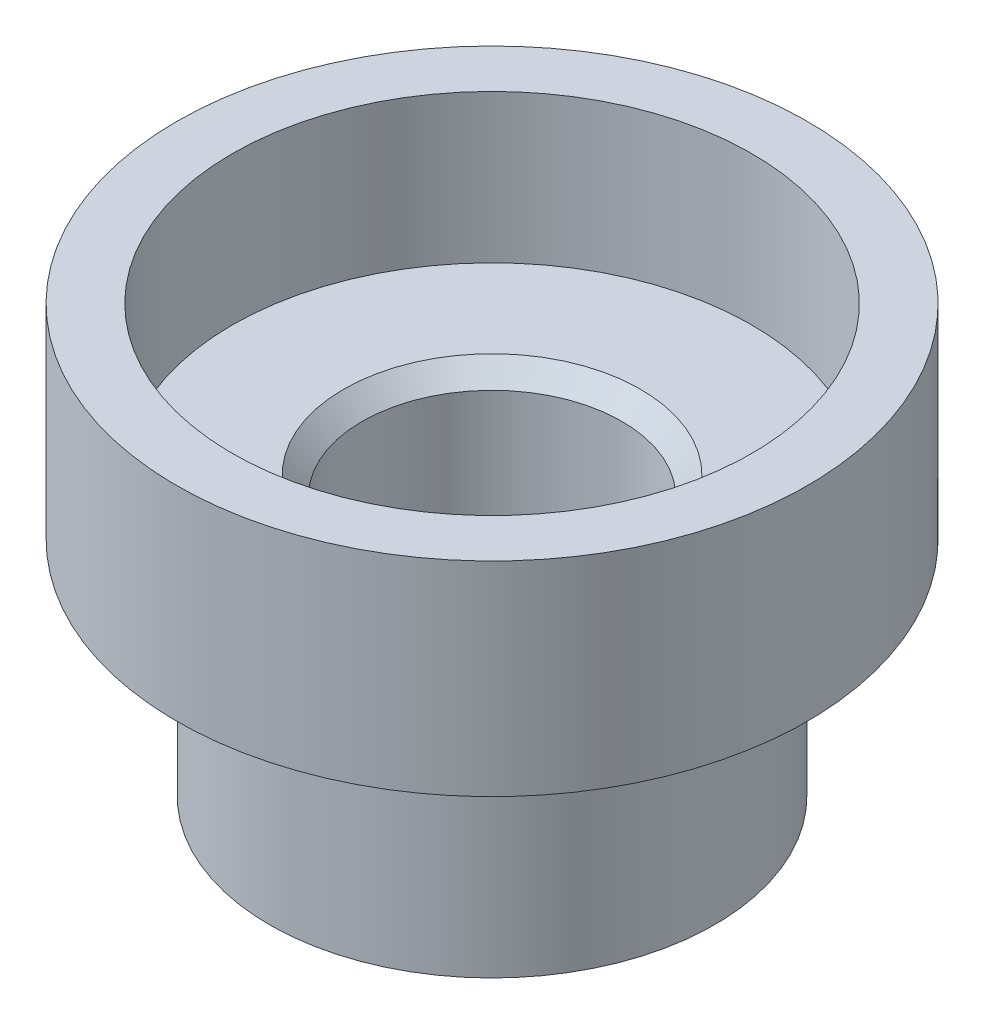
ISO-10303-21;
HEADER;
FILE_DESCRIPTION(('STEP AP214'),'2;1');
FILE_NAME('part.step','',(''),(''),'','','');
FILE_SCHEMA(('AUTOMOTIVE_DESIGN { 1 0 10303 214 1 1 1 1 }'));
ENDSEC;
DATA;
#1=APPLICATION_CONTEXT('core data for automotive mechanical design processes');
#2=APPLICATION_PROTOCOL_DEFINITION('international standard','automotive_design',2000,#1);
#3=PRODUCT_CONTEXT('',#1,'mechanical');
#4=PRODUCT('Part','Part','',(#3));
#5=PRODUCT_RELATED_PRODUCT_CATEGORY('part','',(#4));
#6=PRODUCT_DEFINITION_FORMATION('','',#4);
#7=PRODUCT_DEFINITION_CONTEXT('part definition',#1,'design');
#8=PRODUCT_DEFINITION('design','',#6,#7);
#9=PRODUCT_DEFINITION_SHAPE('','',#8);
#10=(LENGTH_UNIT() NAMED_UNIT(*) SI_UNIT(.MILLI.,.METRE.));
#11=(NAMED_UNIT(*) PLANE_ANGLE_UNIT() SI_UNIT($,.RADIAN.));
#12=(NAMED_UNIT(*) SI_UNIT($,.STERADIAN.) SOLID_ANGLE_UNIT());
#13=UNCERTAINTY_MEASURE_WITH_UNIT(LENGTH_MEASURE(1.E-05),#10,'distance_accuracy_value','');
#14=(GEOMETRIC_REPRESENTATION_CONTEXT(3) GLOBAL_UNCERTAINTY_ASSIGNED_CONTEXT((#13)) GLOBAL_UNIT_ASSIGNED_CONTEXT((#10,
#11,#12)) REPRESENTATION_CONTEXT('',''));
#15=CARTESIAN_POINT('',(0.,0.,0.));
#16=DIRECTION('',(0.,0.,1.));
#17=DIRECTION('',(1.,0.,0.));
#18=AXIS2_PLACEMENT_3D('',#15,#16,#17);
#19=CARTESIAN_POINT('',(0.,0.,0.));
#20=DIRECTION('',(0.,1.,0.));
#21=DIRECTION('',(1.,0.,0.));
#22=AXIS2_PLACEMENT_3D('',#19,#20,#21);
#23=PLANE('',#22);
#24=CARTESIAN_POINT('',(0.,0.,0.));
#25=DIRECTION('',(0.,1.,0.));
#26=DIRECTION('',(-1.,0.,0.));
#27=AXIS2_PLACEMENT_3D('',#24,#25,#26);
#28=CIRCLE('',#27,3.4);
#29=CARTESIAN_POINT('',(-3.4,0.,0.));
#30=VERTEX_POINT('',#29);
#31=EDGE_CURVE('E22',#30,#30,#28,.T.);
#32=ORIENTED_EDGE('',*,*,#31,.T.);
#33=EDGE_LOOP('',(#32));
#34=FACE_BOUND('',#33,.T.);
#35=CARTESIAN_POINT('',(0.,0.,0.));
#36=DIRECTION('',(0.,1.,0.));
#37=DIRECTION('',(-1.,0.,0.));
#38=AXIS2_PLACEMENT_3D('',#35,#36,#37);
#39=CIRCLE('',#38,2.8);
#40=CARTESIAN_POINT('',(-2.8,0.,0.));
#41=VERTEX_POINT('',#40);
#42=EDGE_CURVE('E48',#41,#41,#39,.T.);
#43=ORIENTED_EDGE('',*,*,#42,.F.);
#44=EDGE_LOOP('',(#43));
#45=FACE_BOUND('',#44,.T.);
#46=ADVANCED_FACE('F15',(#34,#45),#23,.T.);
#47=CARTESIAN_POINT('',(0.,-2.2,0.));
#48=DIRECTION('',(0.,-1.,0.));
#49=DIRECTION('',(0.,0.,-1.));
#50=AXIS2_PLACEMENT_3D('',#47,#48,#49);
#51=PLANE('',#50);
#52=CARTESIAN_POINT('',(0.,-2.2,0.));
#53=DIRECTION('',(0.,1.,0.));
#54=DIRECTION('',(-1.,0.,0.));
#55=AXIS2_PLACEMENT_3D('',#52,#53,#54);
#56=CIRCLE('',#55,3.4);
#57=CARTESIAN_POINT('',(-3.4,-2.2,0.));
#58=VERTEX_POINT('',#57);
#59=EDGE_CURVE('E10',#58,#58,#56,.T.);
#60=ORIENTED_EDGE('',*,*,#59,.F.);
#61=EDGE_LOOP('',(#60));
#62=FACE_BOUND('',#61,.T.);
#63=CARTESIAN_POINT('',(0.,-2.2,0.));
#64=DIRECTION('',(0.,1.,0.));
#65=DIRECTION('',(-1.,0.,0.));
#66=AXIS2_PLACEMENT_3D('',#63,#64,#65);
#67=CIRCLE('',#66,2.6);
#68=CARTESIAN_POINT('',(-2.6,-2.2,0.));
#69=VERTEX_POINT('',#68);
#70=EDGE_CURVE('E39',#69,#69,#67,.T.);
#71=ORIENTED_EDGE('',*,*,#70,.T.);
#72=EDGE_LOOP('',(#71));
#73=FACE_BOUND('',#72,.T.);
#74=ADVANCED_FACE('F67',(#62,#73),#51,.T.);
#75=CARTESIAN_POINT('',(0.,0.,0.));
#76=DIRECTION('',(0.,1.,0.));
#77=DIRECTION('',(1.,0.,0.));
#78=AXIS2_PLACEMENT_3D('',#75,#76,#77);
#79=CYLINDRICAL_SURFACE('',#78,3.4);
#80=ORIENTED_EDGE('',*,*,#31,.F.);
#81=EDGE_LOOP('',(#80));
#82=FACE_BOUND('',#81,.T.);
#83=ORIENTED_EDGE('',*,*,#59,.T.);
#84=EDGE_LOOP('',(#83));
#85=FACE_BOUND('',#84,.T.);
#86=ADVANCED_FACE('F83',(#82,#85),#79,.T.);
#87=CARTESIAN_POINT('',(0.,-2.08,0.));
#88=DIRECTION('',(0.,-1.,0.));
#89=DIRECTION('',(-1.,0.,0.));
#90=AXIS2_PLACEMENT_3D('',#87,#88,#89);
#91=CYLINDRICAL_SURFACE('',#90,2.4);
#92=CARTESIAN_POINT('',(0.,-4.6,0.));
#93=DIRECTION('',(0.,-1.,0.));
#94=DIRECTION('',(-1.,0.,0.));
#95=AXIS2_PLACEMENT_3D('',#92,#93,#94);
#96=CIRCLE('',#95,2.4);
#97=CARTESIAN_POINT('',(-2.4,-4.6,0.));
#98=VERTEX_POINT('',#97);
#99=EDGE_CURVE('E56',#98,#98,#96,.T.);
#100=ORIENTED_EDGE('',*,*,#99,.F.);
#101=EDGE_LOOP('',(#100));
#102=FACE_BOUND('',#101,.T.);
#103=CARTESIAN_POINT('',(0.,-2.4,0.));
#104=DIRECTION('',(0.,1.,0.));
#105=DIRECTION('',(-1.,0.,0.));
#106=AXIS2_PLACEMENT_3D('',#103,#104,#105);
#107=CIRCLE('',#106,2.4);
#108=CARTESIAN_POINT('',(-2.4,-2.4,0.));
#109=VERTEX_POINT('',#108);
#110=EDGE_CURVE('E31',#109,#109,#107,.T.);
#111=ORIENTED_EDGE('',*,*,#110,.F.);
#112=EDGE_LOOP('',(#111));
#113=FACE_BOUND('',#112,.T.);
#114=ADVANCED_FACE('F72',(#102,#113),#91,.T.);
#115=CARTESIAN_POINT('',(0.,-2.4,0.));
#116=DIRECTION('',(0.,-1.,0.));
#117=DIRECTION('',(-0.999978425521982,0.,-0.00656875106682888));
#118=AXIS2_PLACEMENT_3D('',#115,#116,#117);
#119=TOROIDAL_SURFACE('',#118,2.6,0.2);
#120=ORIENTED_EDGE('',*,*,#110,.T.);
#121=EDGE_LOOP('',(#120));
#122=FACE_BOUND('',#121,.T.);
#123=ORIENTED_EDGE('',*,*,#70,.F.);
#124=EDGE_LOOP('',(#123));
#125=FACE_BOUND('',#124,.T.);
#126=ADVANCED_FACE('F69',(#122,#125),#119,.F.);
#127=CARTESIAN_POINT('',(0.,-4.6,0.));
#128=DIRECTION('',(0.,1.,0.));
#129=DIRECTION('',(1.,0.,0.));
#130=AXIS2_PLACEMENT_3D('',#127,#128,#129);
#131=PLANE('',#130);
#132=ORIENTED_EDGE('',*,*,#99,.T.);
#133=EDGE_LOOP('',(#132));
#134=FACE_BOUND('',#133,.T.);
#135=CARTESIAN_POINT('',(0.,-4.6,0.));
#136=DIRECTION('',(0.,1.,0.));
#137=DIRECTION('',(-1.,0.,0.));
#138=AXIS2_PLACEMENT_3D('',#135,#136,#137);
#139=CIRCLE('',#138,1.4);
#140=CARTESIAN_POINT('',(-1.4,-4.6,0.));
#141=VERTEX_POINT('',#140);
#142=EDGE_CURVE('E42',#141,#141,#139,.T.);
#143=ORIENTED_EDGE('',*,*,#142,.T.);
#144=EDGE_LOOP('',(#143));
#145=FACE_BOUND('',#144,.T.);
#146=ADVANCED_FACE('F71',(#134,#145),#131,.F.);
#147=CARTESIAN_POINT('',(0.,-1.700000000067,0.));
#148=DIRECTION('',(0.,1.,0.));
#149=DIRECTION('',(0.,0.,-1.));
#150=AXIS2_PLACEMENT_3D('',#147,#148,#149);
#151=CONICAL_SURFACE('',#150,1.499999999933,0.78539925244966);
#152=CARTESIAN_POINT('',(0.,-1.6,0.));
#153=DIRECTION('',(0.,1.,0.));
#154=DIRECTION('',(-1.,0.,0.));
#155=AXIS2_PLACEMENT_3D('',#152,#153,#154);
#156=CIRCLE('',#155,1.6);
#157=CARTESIAN_POINT('',(-1.6,-1.6,0.));
#158=VERTEX_POINT('',#157);
#159=EDGE_CURVE('E52',#158,#158,#156,.T.);
#160=ORIENTED_EDGE('',*,*,#159,.T.);
#161=EDGE_LOOP('',(#160));
#162=FACE_BOUND('',#161,.T.);
#163=CARTESIAN_POINT('',(0.,-1.8,0.));
#164=DIRECTION('',(0.,1.,0.));
#165=DIRECTION('',(-1.,0.,0.));
#166=AXIS2_PLACEMENT_3D('',#163,#164,#165);
#167=CIRCLE('',#166,1.4);
#168=CARTESIAN_POINT('',(-1.4,-1.8,0.));
#169=VERTEX_POINT('',#168);
#170=EDGE_CURVE('E60',#169,#169,#167,.T.);
#171=ORIENTED_EDGE('',*,*,#170,.F.);
#172=EDGE_LOOP('',(#171));
#173=FACE_BOUND('',#172,.T.);
#174=ADVANCED_FACE('F80',(#162,#173),#151,.F.);
#175=CARTESIAN_POINT('',(0.,0.,0.));
#176=DIRECTION('',(0.,1.,0.));
#177=DIRECTION('',(1.,0.,0.));
#178=AXIS2_PLACEMENT_3D('',#175,#176,#177);
#179=CYLINDRICAL_SURFACE('',#178,1.4);
#180=ORIENTED_EDGE('',*,*,#170,.T.);
#181=EDGE_LOOP('',(#180));
#182=FACE_BOUND('',#181,.T.);
#183=ORIENTED_EDGE('',*,*,#142,.F.);
#184=EDGE_LOOP('',(#183));
#185=FACE_BOUND('',#184,.T.);
#186=ADVANCED_FACE('F104',(#182,#185),#179,.F.);
#187=CARTESIAN_POINT('',(0.,-1.6,0.));
#188=DIRECTION('',(0.,1.,0.));
#189=DIRECTION('',(1.,0.,0.));
#190=AXIS2_PLACEMENT_3D('',#187,#188,#189);
#191=PLANE('',#190);
#192=CARTESIAN_POINT('',(0.,-1.6,0.));
#193=DIRECTION('',(0.,1.,0.));
#194=DIRECTION('',(-1.,0.,0.));
#195=AXIS2_PLACEMENT_3D('',#192,#193,#194);
#196=CIRCLE('',#195,2.8);
#197=CARTESIAN_POINT('',(-2.8,-1.6,0.));
#198=VERTEX_POINT('',#197);
#199=EDGE_CURVE('E44',#198,#198,#196,.T.);
#200=ORIENTED_EDGE('',*,*,#199,.T.);
#201=EDGE_LOOP('',(#200));
#202=FACE_BOUND('',#201,.T.);
#203=ORIENTED_EDGE('',*,*,#159,.F.);
#204=EDGE_LOOP('',(#203));
#205=FACE_BOUND('',#204,.T.);
#206=ADVANCED_FACE('F98',(#202,#205),#191,.T.);
#207=CARTESIAN_POINT('',(0.,0.,0.));
#208=DIRECTION('',(0.,1.,0.));
#209=DIRECTION('',(1.,0.,0.));
#210=AXIS2_PLACEMENT_3D('',#207,#208,#209);
#211=CYLINDRICAL_SURFACE('',#210,2.8);
#212=ORIENTED_EDGE('',*,*,#42,.T.);
#213=EDGE_LOOP('',(#212));
#214=FACE_BOUND('',#213,.T.);
#215=ORIENTED_EDGE('',*,*,#199,.F.);
#216=EDGE_LOOP('',(#215));
#217=FACE_BOUND('',#216,.T.);
#218=ADVANCED_FACE('F95',(#214,#217),#211,.F.);
#219=CLOSED_SHELL('',(#46,#74,#86,#114,#126,#146,#174,#186,#206,#218));
#220=MANIFOLD_SOLID_BREP('B1',#219);
#221=ADVANCED_BREP_SHAPE_REPRESENTATION('',(#18,#220),#14);
#222=SHAPE_DEFINITION_REPRESENTATION(#9,#221);
ENDSEC;
END-ISO-10303-21;
